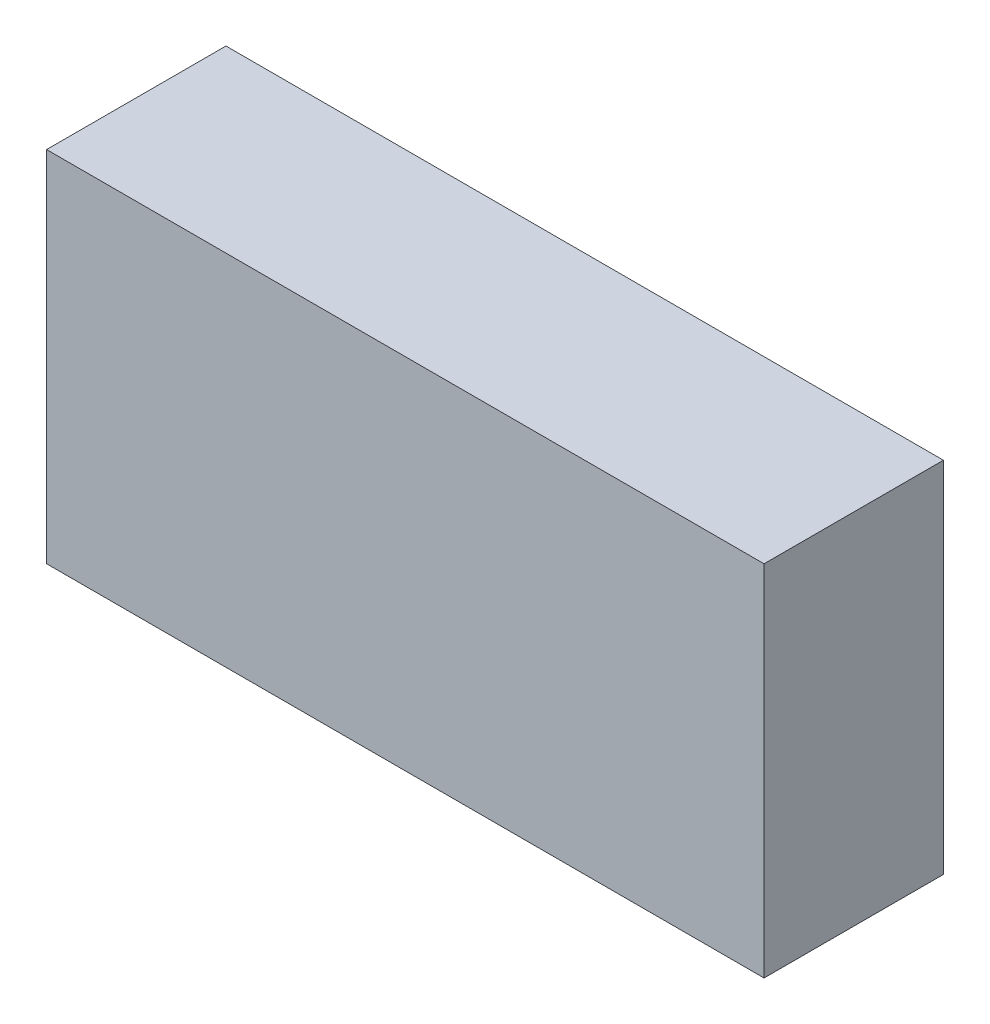
ISO-10303-21;
HEADER;
FILE_DESCRIPTION(('STEP AP214'),'2;1');
FILE_NAME('part.step','',(''),(''),'','','');
FILE_SCHEMA(('AUTOMOTIVE_DESIGN { 1 0 10303 214 1 1 1 1 }'));
ENDSEC;
DATA;
#1=APPLICATION_CONTEXT('core data for automotive mechanical design processes');
#2=APPLICATION_PROTOCOL_DEFINITION('international standard','automotive_design',2000,#1);
#3=PRODUCT_CONTEXT('',#1,'mechanical');
#4=PRODUCT('Part','Part','',(#3));
#5=PRODUCT_RELATED_PRODUCT_CATEGORY('part','',(#4));
#6=PRODUCT_DEFINITION_FORMATION('','',#4);
#7=PRODUCT_DEFINITION_CONTEXT('part definition',#1,'design');
#8=PRODUCT_DEFINITION('design','',#6,#7);
#9=PRODUCT_DEFINITION_SHAPE('','',#8);
#10=(LENGTH_UNIT() NAMED_UNIT(*) SI_UNIT(.MILLI.,.METRE.));
#11=(NAMED_UNIT(*) PLANE_ANGLE_UNIT() SI_UNIT($,.RADIAN.));
#12=(NAMED_UNIT(*) SI_UNIT($,.STERADIAN.) SOLID_ANGLE_UNIT());
#13=UNCERTAINTY_MEASURE_WITH_UNIT(LENGTH_MEASURE(1.E-05),#10,'distance_accuracy_value','');
#14=(GEOMETRIC_REPRESENTATION_CONTEXT(3) GLOBAL_UNCERTAINTY_ASSIGNED_CONTEXT((#13)) GLOBAL_UNIT_ASSIGNED_CONTEXT((#10,
#11,#12)) REPRESENTATION_CONTEXT('',''));
#15=CARTESIAN_POINT('',(0.,0.,0.));
#16=DIRECTION('',(0.,0.,1.));
#17=DIRECTION('',(1.,0.,0.));
#18=AXIS2_PLACEMENT_3D('',#15,#16,#17);
#19=CARTESIAN_POINT('',(0.,0.,-20.));
#20=DIRECTION('',(-1.,0.,0.));
#21=DIRECTION('',(0.,0.,1.));
#22=AXIS2_PLACEMENT_3D('',#19,#20,#21);
#23=PLANE('',#22);
#24=DIRECTION('',(0.,-1.,0.));
#25=VECTOR('',#24,1.);
#26=CARTESIAN_POINT('',(0.,0.,0.));
#27=LINE('',#26,#25);
#28=CARTESIAN_POINT('',(0.,40.,0.));
#29=VERTEX_POINT('',#28);
#30=CARTESIAN_POINT('',(0.,0.,0.));
#31=VERTEX_POINT('',#30);
#32=EDGE_CURVE('E103',#29,#31,#27,.T.);
#33=ORIENTED_EDGE('',*,*,#32,.F.);
#34=DIRECTION('',(0.,0.,1.));
#35=VECTOR('',#34,1.);
#36=CARTESIAN_POINT('',(0.,40.,-20.));
#37=LINE('',#36,#35);
#38=CARTESIAN_POINT('',(0.,40.,-20.));
#39=VERTEX_POINT('',#38);
#40=EDGE_CURVE('E51',#39,#29,#37,.T.);
#41=ORIENTED_EDGE('',*,*,#40,.F.);
#42=DIRECTION('',(0.,-1.,0.));
#43=VECTOR('',#42,1.);
#44=CARTESIAN_POINT('',(0.,0.,-20.));
#45=LINE('',#44,#43);
#46=CARTESIAN_POINT('',(0.,0.,-20.));
#47=VERTEX_POINT('',#46);
#48=EDGE_CURVE('E96',#39,#47,#45,.T.);
#49=ORIENTED_EDGE('',*,*,#48,.T.);
#50=DIRECTION('',(0.,0.,1.));
#51=VECTOR('',#50,1.);
#52=CARTESIAN_POINT('',(0.,0.,-20.));
#53=LINE('',#52,#51);
#54=EDGE_CURVE('E79',#47,#31,#53,.T.);
#55=ORIENTED_EDGE('',*,*,#54,.T.);
#56=EDGE_LOOP('',(#33,#41,#49,#55));
#57=FACE_BOUND('',#56,.T.);
#58=ADVANCED_FACE('F35',(#57),#23,.T.);
#59=CARTESIAN_POINT('',(0.,40.,-20.));
#60=DIRECTION('',(0.,1.,0.));
#61=DIRECTION('',(0.,0.,1.));
#62=AXIS2_PLACEMENT_3D('',#59,#60,#61);
#63=PLANE('',#62);
#64=DIRECTION('',(-1.,0.,0.));
#65=VECTOR('',#64,1.);
#66=CARTESIAN_POINT('',(0.,40.,0.));
#67=LINE('',#66,#65);
#68=CARTESIAN_POINT('',(80.,40.,0.));
#69=VERTEX_POINT('',#68);
#70=EDGE_CURVE('E98',#69,#29,#67,.T.);
#71=ORIENTED_EDGE('',*,*,#70,.F.);
#72=DIRECTION('',(0.,0.,1.));
#73=VECTOR('',#72,1.);
#74=CARTESIAN_POINT('',(80.,40.,-20.));
#75=LINE('',#74,#73);
#76=CARTESIAN_POINT('',(80.,40.,-20.));
#77=VERTEX_POINT('',#76);
#78=EDGE_CURVE('E68',#77,#69,#75,.T.);
#79=ORIENTED_EDGE('',*,*,#78,.F.);
#80=DIRECTION('',(-1.,0.,0.));
#81=VECTOR('',#80,1.);
#82=CARTESIAN_POINT('',(0.,40.,-20.));
#83=LINE('',#82,#81);
#84=EDGE_CURVE('E93',#77,#39,#83,.T.);
#85=ORIENTED_EDGE('',*,*,#84,.T.);
#86=ORIENTED_EDGE('',*,*,#40,.T.);
#87=EDGE_LOOP('',(#71,#79,#85,#86));
#88=FACE_BOUND('',#87,.T.);
#89=ADVANCED_FACE('F115',(#88),#63,.T.);
#90=CARTESIAN_POINT('',(80.,0.,-20.));
#91=DIRECTION('',(1.,0.,0.));
#92=DIRECTION('',(0.,0.,-1.));
#93=AXIS2_PLACEMENT_3D('',#90,#91,#92);
#94=PLANE('',#93);
#95=DIRECTION('',(0.,1.,0.));
#96=VECTOR('',#95,1.);
#97=CARTESIAN_POINT('',(80.,0.,0.));
#98=LINE('',#97,#96);
#99=CARTESIAN_POINT('',(80.,0.,0.));
#100=VERTEX_POINT('',#99);
#101=EDGE_CURVE('E87',#100,#69,#98,.T.);
#102=ORIENTED_EDGE('',*,*,#101,.F.);
#103=DIRECTION('',(0.,0.,1.));
#104=VECTOR('',#103,1.);
#105=CARTESIAN_POINT('',(80.,0.,-20.));
#106=LINE('',#105,#104);
#107=CARTESIAN_POINT('',(80.,0.,-20.));
#108=VERTEX_POINT('',#107);
#109=EDGE_CURVE('E82',#108,#100,#106,.T.);
#110=ORIENTED_EDGE('',*,*,#109,.F.);
#111=DIRECTION('',(0.,1.,0.));
#112=VECTOR('',#111,1.);
#113=CARTESIAN_POINT('',(80.,0.,-20.));
#114=LINE('',#113,#112);
#115=EDGE_CURVE('E85',#108,#77,#114,.T.);
#116=ORIENTED_EDGE('',*,*,#115,.T.);
#117=ORIENTED_EDGE('',*,*,#78,.T.);
#118=EDGE_LOOP('',(#102,#110,#116,#117));
#119=FACE_BOUND('',#118,.T.);
#120=ADVANCED_FACE('F84',(#119),#94,.T.);
#121=CARTESIAN_POINT('',(0.,0.,-20.));
#122=DIRECTION('',(0.,-1.,0.));
#123=DIRECTION('',(0.,0.,-1.));
#124=AXIS2_PLACEMENT_3D('',#121,#122,#123);
#125=PLANE('',#124);
#126=DIRECTION('',(1.,0.,0.));
#127=VECTOR('',#126,1.);
#128=CARTESIAN_POINT('',(0.,0.,0.));
#129=LINE('',#128,#127);
#130=EDGE_CURVE('E106',#31,#100,#129,.T.);
#131=ORIENTED_EDGE('',*,*,#130,.F.);
#132=ORIENTED_EDGE('',*,*,#54,.F.);
#133=DIRECTION('',(1.,0.,0.));
#134=VECTOR('',#133,1.);
#135=CARTESIAN_POINT('',(0.,0.,-20.));
#136=LINE('',#135,#134);
#137=EDGE_CURVE('E92',#47,#108,#136,.T.);
#138=ORIENTED_EDGE('',*,*,#137,.T.);
#139=ORIENTED_EDGE('',*,*,#109,.T.);
#140=EDGE_LOOP('',(#131,#132,#138,#139));
#141=FACE_BOUND('',#140,.T.);
#142=ADVANCED_FACE('F95',(#141),#125,.T.);
#143=CARTESIAN_POINT('',(0.,0.,-20.));
#144=DIRECTION('',(0.,0.,-1.));
#145=DIRECTION('',(-1.,0.,0.));
#146=AXIS2_PLACEMENT_3D('',#143,#144,#145);
#147=PLANE('',#146);
#148=CARTESIAN_POINT('',(65.,20.,-20.));
#149=DIRECTION('',(0.,0.,-1.));
#150=DIRECTION('',(-1.,0.,0.));
#151=AXIS2_PLACEMENT_3D('',#148,#149,#150);
#152=CIRCLE('',#151,5.);
#153=CARTESIAN_POINT('',(60.,20.,-20.));
#154=VERTEX_POINT('',#153);
#155=EDGE_CURVE('E11',#154,#154,#152,.T.);
#156=ORIENTED_EDGE('',*,*,#155,.F.);
#157=EDGE_LOOP('',(#156));
#158=FACE_BOUND('',#157,.T.);
#159=CARTESIAN_POINT('',(15.,20.,-20.));
#160=DIRECTION('',(0.,0.,-1.));
#161=DIRECTION('',(-1.,0.,0.));
#162=AXIS2_PLACEMENT_3D('',#159,#160,#161);
#163=CIRCLE('',#162,5.);
#164=CARTESIAN_POINT('',(9.99999999999999,20.,-20.));
#165=VERTEX_POINT('',#164);
#166=EDGE_CURVE('E166',#165,#165,#163,.T.);
#167=ORIENTED_EDGE('',*,*,#166,.F.);
#168=EDGE_LOOP('',(#167));
#169=FACE_BOUND('',#168,.T.);
#170=CARTESIAN_POINT('',(40.,20.,-20.));
#171=DIRECTION('',(0.,0.,-1.));
#172=DIRECTION('',(-1.,0.,0.));
#173=AXIS2_PLACEMENT_3D('',#170,#171,#172);
#174=CIRCLE('',#173,10.);
#175=CARTESIAN_POINT('',(30.,20.,-20.));
#176=VERTEX_POINT('',#175);
#177=EDGE_CURVE('E43',#176,#176,#174,.T.);
#178=ORIENTED_EDGE('',*,*,#177,.F.);
#179=EDGE_LOOP('',(#178));
#180=FACE_BOUND('',#179,.T.);
#181=ORIENTED_EDGE('',*,*,#48,.F.);
#182=ORIENTED_EDGE('',*,*,#84,.F.);
#183=ORIENTED_EDGE('',*,*,#115,.F.);
#184=ORIENTED_EDGE('',*,*,#137,.F.);
#185=EDGE_LOOP('',(#181,#182,#183,#184));
#186=FACE_BOUND('',#185,.T.);
#187=ADVANCED_FACE('F91',(#158,#169,#180,#186),#147,.T.);
#188=CARTESIAN_POINT('',(0.,0.,0.));
#189=DIRECTION('',(0.,0.,-1.));
#190=DIRECTION('',(-1.,0.,0.));
#191=AXIS2_PLACEMENT_3D('',#188,#189,#190);
#192=PLANE('',#191);
#193=ORIENTED_EDGE('',*,*,#32,.T.);
#194=ORIENTED_EDGE('',*,*,#130,.T.);
#195=ORIENTED_EDGE('',*,*,#101,.T.);
#196=ORIENTED_EDGE('',*,*,#70,.T.);
#197=EDGE_LOOP('',(#193,#194,#195,#196));
#198=FACE_BOUND('',#197,.T.);
#199=ADVANCED_FACE('F114',(#198),#192,.F.);
#200=CARTESIAN_POINT('',(40.,20.,-25.));
#201=DIRECTION('',(0.,0.,1.));
#202=DIRECTION('',(1.,0.,0.));
#203=AXIS2_PLACEMENT_3D('',#200,#201,#202);
#204=CYLINDRICAL_SURFACE('',#203,10.);
#205=CARTESIAN_POINT('',(40.,20.,-25.));
#206=DIRECTION('',(0.,0.,-1.));
#207=DIRECTION('',(-1.,0.,0.));
#208=AXIS2_PLACEMENT_3D('',#205,#206,#207);
#209=CIRCLE('',#208,10.);
#210=CARTESIAN_POINT('',(30.,20.,-25.));
#211=VERTEX_POINT('',#210);
#212=EDGE_CURVE('E107',#211,#211,#209,.T.);
#213=ORIENTED_EDGE('',*,*,#212,.F.);
#214=EDGE_LOOP('',(#213));
#215=FACE_BOUND('',#214,.T.);
#216=ORIENTED_EDGE('',*,*,#177,.T.);
#217=EDGE_LOOP('',(#216));
#218=FACE_BOUND('',#217,.T.);
#219=ADVANCED_FACE('F135',(#215,#218),#204,.T.);
#220=CARTESIAN_POINT('',(40.,20.,-25.));
#221=DIRECTION('',(0.,0.,-1.));
#222=DIRECTION('',(-1.,0.,0.));
#223=AXIS2_PLACEMENT_3D('',#220,#221,#222);
#224=PLANE('',#223);
#225=ORIENTED_EDGE('',*,*,#212,.T.);
#226=EDGE_LOOP('',(#225));
#227=FACE_BOUND('',#226,.T.);
#228=ADVANCED_FACE('F141',(#227),#224,.T.);
#229=CARTESIAN_POINT('',(15.,20.,-30.));
#230=DIRECTION('',(0.,0.,1.));
#231=DIRECTION('',(1.,0.,0.));
#232=AXIS2_PLACEMENT_3D('',#229,#230,#231);
#233=CYLINDRICAL_SURFACE('',#232,5.);
#234=CARTESIAN_POINT('',(15.,20.,-30.));
#235=DIRECTION('',(0.,0.,-1.));
#236=DIRECTION('',(-1.,0.,0.));
#237=AXIS2_PLACEMENT_3D('',#234,#235,#236);
#238=CIRCLE('',#237,5.);
#239=CARTESIAN_POINT('',(9.99999999999999,20.,-30.));
#240=VERTEX_POINT('',#239);
#241=EDGE_CURVE('E169',#240,#240,#238,.T.);
#242=ORIENTED_EDGE('',*,*,#241,.F.);
#243=EDGE_LOOP('',(#242));
#244=FACE_BOUND('',#243,.T.);
#245=ORIENTED_EDGE('',*,*,#166,.T.);
#246=EDGE_LOOP('',(#245));
#247=FACE_BOUND('',#246,.T.);
#248=ADVANCED_FACE('F145',(#244,#247),#233,.T.);
#249=CARTESIAN_POINT('',(15.,20.,-30.));
#250=DIRECTION('',(0.,0.,-1.));
#251=DIRECTION('',(-1.,0.,0.));
#252=AXIS2_PLACEMENT_3D('',#249,#250,#251);
#253=PLANE('',#252);
#254=ORIENTED_EDGE('',*,*,#241,.T.);
#255=EDGE_LOOP('',(#254));
#256=FACE_BOUND('',#255,.T.);
#257=ADVANCED_FACE('F149',(#256),#253,.T.);
#258=CARTESIAN_POINT('',(65.,20.,-30.));
#259=DIRECTION('',(0.,0.,1.));
#260=DIRECTION('',(1.,0.,0.));
#261=AXIS2_PLACEMENT_3D('',#258,#259,#260);
#262=CYLINDRICAL_SURFACE('',#261,5.);
#263=CARTESIAN_POINT('',(65.,20.,-30.));
#264=DIRECTION('',(0.,0.,1.));
#265=DIRECTION('',(1.,0.,0.));
#266=AXIS2_PLACEMENT_3D('',#263,#264,#265);
#267=CIRCLE('',#266,5.);
#268=CARTESIAN_POINT('',(70.,20.,-30.));
#269=VERTEX_POINT('',#268);
#270=EDGE_CURVE('E165',#269,#269,#267,.T.);
#271=ORIENTED_EDGE('',*,*,#270,.T.);
#272=EDGE_LOOP('',(#271));
#273=FACE_BOUND('',#272,.T.);
#274=ORIENTED_EDGE('',*,*,#155,.T.);
#275=EDGE_LOOP('',(#274));
#276=FACE_BOUND('',#275,.T.);
#277=ADVANCED_FACE('F153',(#273,#276),#262,.T.);
#278=CARTESIAN_POINT('',(65.,20.,-30.));
#279=DIRECTION('',(0.,0.,-1.));
#280=DIRECTION('',(1.,0.,0.));
#281=AXIS2_PLACEMENT_3D('',#278,#279,#280);
#282=PLANE('',#281);
#283=ORIENTED_EDGE('',*,*,#270,.F.);
#284=EDGE_LOOP('',(#283));
#285=FACE_BOUND('',#284,.T.);
#286=ADVANCED_FACE('F157',(#285),#282,.T.);
#287=CLOSED_SHELL('',(#58,#89,#120,#142,#187,#199,#219,#228,#248,#257,#277,#286));
#288=MANIFOLD_SOLID_BREP('B2',#287);
#289=ADVANCED_BREP_SHAPE_REPRESENTATION('',(#18,#288),#14);
#290=SHAPE_DEFINITION_REPRESENTATION(#9,#289);
ENDSEC;
END-ISO-10303-21;
